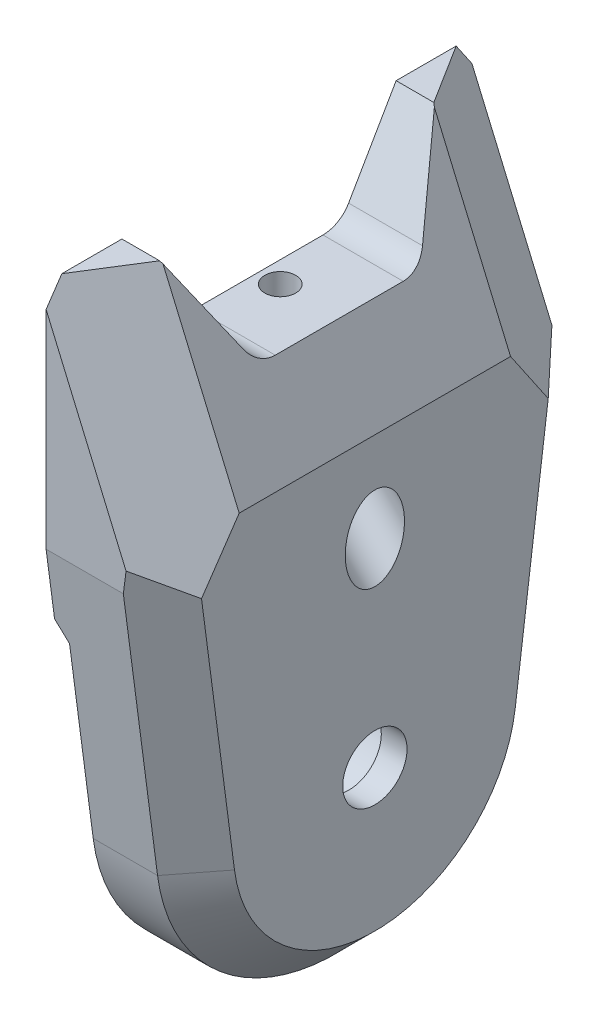
ISO-10303-21;
HEADER;
FILE_DESCRIPTION(('STEP AP214'),'2;1');
FILE_NAME('part.step','',(''),(''),'','','');
FILE_SCHEMA(('AUTOMOTIVE_DESIGN { 1 0 10303 214 1 1 1 1 }'));
ENDSEC;
DATA;
#1=APPLICATION_CONTEXT('core data for automotive mechanical design processes');
#2=APPLICATION_PROTOCOL_DEFINITION('international standard','automotive_design',2000,#1);
#3=PRODUCT_CONTEXT('',#1,'mechanical');
#4=PRODUCT('Part','Part','',(#3));
#5=PRODUCT_RELATED_PRODUCT_CATEGORY('part','',(#4));
#6=PRODUCT_DEFINITION_FORMATION('','',#4);
#7=PRODUCT_DEFINITION_CONTEXT('part definition',#1,'design');
#8=PRODUCT_DEFINITION('design','',#6,#7);
#9=PRODUCT_DEFINITION_SHAPE('','',#8);
#10=(LENGTH_UNIT() NAMED_UNIT(*) SI_UNIT(.MILLI.,.METRE.));
#11=(NAMED_UNIT(*) PLANE_ANGLE_UNIT() SI_UNIT($,.RADIAN.));
#12=(NAMED_UNIT(*) SI_UNIT($,.STERADIAN.) SOLID_ANGLE_UNIT());
#13=UNCERTAINTY_MEASURE_WITH_UNIT(LENGTH_MEASURE(1.E-05),#10,'distance_accuracy_value','');
#14=(GEOMETRIC_REPRESENTATION_CONTEXT(3) GLOBAL_UNCERTAINTY_ASSIGNED_CONTEXT((#13)) GLOBAL_UNIT_ASSIGNED_CONTEXT((#10,
#11,#12)) REPRESENTATION_CONTEXT('',''));
#15=CARTESIAN_POINT('',(0.,0.,0.));
#16=DIRECTION('',(0.,0.,1.));
#17=DIRECTION('',(1.,0.,0.));
#18=AXIS2_PLACEMENT_3D('',#15,#16,#17);
#19=CARTESIAN_POINT('',(-4.,0.,0.));
#20=DIRECTION('',(1.,0.,0.));
#21=DIRECTION('',(0.,0.,-1.));
#22=AXIS2_PLACEMENT_3D('',#19,#20,#21);
#23=CYLINDRICAL_SURFACE('',#22,2.25);
#24=CARTESIAN_POINT('',(-4.,0.,0.));
#25=DIRECTION('',(1.,0.,0.));
#26=DIRECTION('',(0.,0.,-1.));
#27=AXIS2_PLACEMENT_3D('',#24,#25,#26);
#28=CIRCLE('',#27,2.25);
#29=CARTESIAN_POINT('',(-4.,0.,-2.25));
#30=VERTEX_POINT('',#29);
#31=EDGE_CURVE('E216',#30,#30,#28,.T.);
#32=ORIENTED_EDGE('',*,*,#31,.F.);
#33=EDGE_LOOP('',(#32));
#34=FACE_BOUND('',#33,.T.);
#35=CARTESIAN_POINT('',(-1.,0.,0.));
#36=DIRECTION('',(1.,0.,0.));
#37=DIRECTION('',(0.,0.,-1.));
#38=AXIS2_PLACEMENT_3D('',#35,#36,#37);
#39=CIRCLE('',#38,2.25);
#40=CARTESIAN_POINT('',(-1.,0.,-2.25));
#41=VERTEX_POINT('',#40);
#42=EDGE_CURVE('E263',#41,#41,#39,.F.);
#43=ORIENTED_EDGE('',*,*,#42,.F.);
#44=EDGE_LOOP('',(#43));
#45=FACE_BOUND('',#44,.T.);
#46=ADVANCED_FACE('F55',(#34,#45),#23,.F.);
#47=CARTESIAN_POINT('',(-4.5,-0.90952668653246,6.9406599979026));
#48=DIRECTION('',(0.,0.129932383790351,-0.991522856843228));
#49=DIRECTION('',(0.,0.991522856843228,0.129932383790351));
#50=AXIS2_PLACEMENT_3D('',#47,#48,#49);
#51=PLANE('',#50);
#52=DIRECTION('',(0.,0.991522856843228,0.129932383790351));
#53=VECTOR('',#52,1.);
#54=CARTESIAN_POINT('',(-4.5,-0.90952668653246,6.9406599979026));
#55=LINE('',#54,#53);
#56=CARTESIAN_POINT('',(-4.5,6.7265897388865,7.94132155926509));
#57=VERTEX_POINT('',#56);
#58=CARTESIAN_POINT('',(-4.5,9.23475727213278,8.27));
#59=VERTEX_POINT('',#58);
#60=EDGE_CURVE('E257',#57,#59,#55,.T.);
#61=ORIENTED_EDGE('',*,*,#60,.F.);
#62=DIRECTION('',(-0.621690055381958,0.776623514190531,0.101771274166774));
#63=VECTOR('',#62,1.);
#64=CARTESIAN_POINT('',(-1.46667801829035,2.93732343695185,7.44476376432495));
#65=LINE('',#64,#63);
#66=CARTESIAN_POINT('',(-4.,6.10198306594125,7.85947106697738));
#67=VERTEX_POINT('',#66);
#68=EDGE_CURVE('E12',#57,#67,#65,.F.);
#69=ORIENTED_EDGE('',*,*,#68,.T.);
#70=DIRECTION('',(0.,0.991522856843228,0.129932383790351));
#71=VECTOR('',#70,1.);
#72=CARTESIAN_POINT('',(-4.,-0.90952668653246,6.9406599979026));
#73=LINE('',#72,#71);
#74=CARTESIAN_POINT('',(-4.,-0.909526686532459,6.9406599979026));
#75=VERTEX_POINT('',#74);
#76=EDGE_CURVE('E219',#75,#67,#73,.T.);
#77=ORIENTED_EDGE('',*,*,#76,.F.);
#78=DIRECTION('',(1.,0.,0.));
#79=VECTOR('',#78,1.);
#80=CARTESIAN_POINT('',(-4.,-0.909526686532459,6.9406599979026));
#81=LINE('',#80,#79);
#82=CARTESIAN_POINT('',(-1.50000000000002,-0.909526686532459,6.9406599979026));
#83=VERTEX_POINT('',#82);
#84=EDGE_CURVE('E204',#75,#83,#81,.T.);
#85=ORIENTED_EDGE('',*,*,#84,.T.);
#86=DIRECTION('',(0.,0.991522856843228,0.129932383790351));
#87=VECTOR('',#86,1.);
#88=CARTESIAN_POINT('',(-1.50000000000002,7.19063448818806,8.00213149425147));
#89=LINE('',#88,#87);
#90=CARTESIAN_POINT('',(-1.50000000000002,9.23475727213278,8.27));
#91=VERTEX_POINT('',#90);
#92=EDGE_CURVE('E333',#83,#91,#89,.T.);
#93=ORIENTED_EDGE('',*,*,#92,.T.);
#94=DIRECTION('',(1.,0.,0.));
#95=VECTOR('',#94,1.);
#96=CARTESIAN_POINT('',(-4.5,9.23475727213278,8.27));
#97=LINE('',#96,#95);
#98=EDGE_CURVE('E260',#59,#91,#97,.T.);
#99=ORIENTED_EDGE('',*,*,#98,.F.);
#100=EDGE_LOOP('',(#61,#69,#77,#85,#93,#99));
#101=FACE_BOUND('',#100,.T.);
#102=ADVANCED_FACE('F221',(#101),#51,.F.);
#103=CARTESIAN_POINT('',(-4.5,0.,8.27));
#104=DIRECTION('',(0.,0.,-1.));
#105=DIRECTION('',(-1.,0.,0.));
#106=AXIS2_PLACEMENT_3D('',#103,#104,#105);
#107=PLANE('',#106);
#108=ORIENTED_EDGE('',*,*,#98,.T.);
#109=DIRECTION('',(0.128849291751935,0.991664187119322,0.));
#110=VECTOR('',#109,1.);
#111=CARTESIAN_POINT('',(-2.79618819740001,-0.74110986420336,8.27));
#112=LINE('',#111,#110);
#113=CARTESIAN_POINT('',(-1.3939868585545,10.0506673505361,8.27));
#114=VERTEX_POINT('',#113);
#115=EDGE_CURVE('E335',#91,#114,#112,.T.);
#116=ORIENTED_EDGE('',*,*,#115,.T.);
#117=DIRECTION('',(-0.393919298579166,0.919145030018059,0.));
#118=VECTOR('',#117,1.);
#119=CARTESIAN_POINT('',(-4.59200589151571,17.512711760779,8.27));
#120=LINE('',#119,#118);
#121=CARTESIAN_POINT('',(-4.5,17.2980313472423,8.27));
#122=VERTEX_POINT('',#121);
#123=EDGE_CURVE('E327',#114,#122,#120,.T.);
#124=ORIENTED_EDGE('',*,*,#123,.T.);
#125=DIRECTION('',(0.,1.,0.));
#126=VECTOR('',#125,1.);
#127=CARTESIAN_POINT('',(-4.5,0.,8.27));
#128=LINE('',#127,#126);
#129=EDGE_CURVE('E254',#59,#122,#128,.T.);
#130=ORIENTED_EDGE('',*,*,#129,.F.);
#131=EDGE_LOOP('',(#108,#116,#124,#130));
#132=FACE_BOUND('',#131,.T.);
#133=ADVANCED_FACE('F397',(#132),#107,.F.);
#134=CARTESIAN_POINT('',(-4.5,18.195,0.));
#135=DIRECTION('',(0.,-1.,0.));
#136=DIRECTION('',(0.,0.,-1.));
#137=AXIS2_PLACEMENT_3D('',#134,#135,#136);
#138=PLANE('',#137);
#139=DIRECTION('',(0.,0.,-1.));
#140=VECTOR('',#139,1.);
#141=CARTESIAN_POINT('',(-4.5,18.195,0.));
#142=LINE('',#141,#140);
#143=CARTESIAN_POINT('',(-4.5,18.195,7.65800883727353));
#144=VERTEX_POINT('',#143);
#145=CARTESIAN_POINT('',(-4.5,18.195,5.32500000000004));
#146=VERTEX_POINT('',#145);
#147=EDGE_CURVE('E251',#144,#146,#142,.T.);
#148=ORIENTED_EDGE('',*,*,#147,.F.);
#149=DIRECTION('',(0.53190866628425,0.,-0.846801730472789));
#150=VECTOR('',#149,1.);
#151=CARTESIAN_POINT('',(-3.00366032600804,18.195,5.27582726056963));
#152=LINE('',#151,#150);
#153=CARTESIAN_POINT('',(-3.03454761084314,18.195,5.32500000000004));
#154=VERTEX_POINT('',#153);
#155=EDGE_CURVE('E329',#144,#154,#152,.T.);
#156=ORIENTED_EDGE('',*,*,#155,.T.);
#157=DIRECTION('',(-1.,0.,0.));
#158=VECTOR('',#157,1.);
#159=CARTESIAN_POINT('',(-4.5,18.195,5.32500000000004));
#160=LINE('',#159,#158);
#161=EDGE_CURVE('E277',#154,#146,#160,.T.);
#162=ORIENTED_EDGE('',*,*,#161,.T.);
#163=EDGE_LOOP('',(#148,#156,#162));
#164=FACE_BOUND('',#163,.T.);
#165=ADVANCED_FACE('F417',(#164),#138,.F.);
#166=CARTESIAN_POINT('',(-4.5,14.425,0.));
#167=DIRECTION('',(0.,-1.,0.));
#168=DIRECTION('',(0.,0.,-1.));
#169=AXIS2_PLACEMENT_3D('',#166,#167,#168);
#170=PLANE('',#169);
#171=CARTESIAN_POINT('',(-3.675,14.425,0.));
#172=DIRECTION('',(0.,-1.,0.));
#173=DIRECTION('',(0.,0.,-1.));
#174=AXIS2_PLACEMENT_3D('',#171,#172,#173);
#175=CIRCLE('',#174,0.6);
#176=CARTESIAN_POINT('',(-3.675,14.425,-0.6));
#177=VERTEX_POINT('',#176);
#178=EDGE_CURVE('E556',#177,#177,#175,.T.);
#179=ORIENTED_EDGE('',*,*,#178,.T.);
#180=EDGE_LOOP('',(#179));
#181=FACE_BOUND('',#180,.T.);
#182=DIRECTION('',(-1.,0.,0.));
#183=VECTOR('',#182,1.);
#184=CARTESIAN_POINT('',(-4.5,14.425,2.4844366755871));
#185=LINE('',#184,#183);
#186=CARTESIAN_POINT('',(-4.5,14.425,2.4844366755871));
#187=VERTEX_POINT('',#186);
#188=CARTESIAN_POINT('',(-1.38428571428573,14.425,2.4844366755871));
#189=VERTEX_POINT('',#188);
#190=EDGE_CURVE('E279',#187,#189,#185,.F.);
#191=ORIENTED_EDGE('',*,*,#190,.T.);
#192=DIRECTION('',(0.,0.,-1.));
#193=VECTOR('',#192,1.);
#194=CARTESIAN_POINT('',(-1.38428571428573,14.425,0.));
#195=LINE('',#194,#193);
#196=CARTESIAN_POINT('',(-1.38428571428573,14.425,-2.4844366755871));
#197=VERTEX_POINT('',#196);
#198=EDGE_CURVE('E297',#189,#197,#195,.T.);
#199=ORIENTED_EDGE('',*,*,#198,.T.);
#200=DIRECTION('',(1.,0.,0.));
#201=VECTOR('',#200,1.);
#202=CARTESIAN_POINT('',(-4.5,14.425,-2.4844366755871));
#203=LINE('',#202,#201);
#204=CARTESIAN_POINT('',(-4.5,14.425,-2.4844366755871));
#205=VERTEX_POINT('',#204);
#206=EDGE_CURVE('E282',#197,#205,#203,.F.);
#207=ORIENTED_EDGE('',*,*,#206,.T.);
#208=DIRECTION('',(0.,0.,-1.));
#209=VECTOR('',#208,1.);
#210=CARTESIAN_POINT('',(-4.5,14.425,0.));
#211=LINE('',#210,#209);
#212=EDGE_CURVE('E248',#187,#205,#211,.T.);
#213=ORIENTED_EDGE('',*,*,#212,.F.);
#214=EDGE_LOOP('',(#191,#199,#207,#213));
#215=FACE_BOUND('',#214,.T.);
#216=ADVANCED_FACE('F421',(#181,#215),#170,.F.);
#217=CARTESIAN_POINT('',(-4.5,18.195,0.));
#218=DIRECTION('',(0.,1.,0.));
#219=DIRECTION('',(0.,0.,1.));
#220=AXIS2_PLACEMENT_3D('',#217,#218,#219);
#221=PLANE('',#220);
#222=DIRECTION('',(1.,0.,0.));
#223=VECTOR('',#222,1.);
#224=CARTESIAN_POINT('',(-4.5,18.195,-5.32500000000004));
#225=LINE('',#224,#223);
#226=CARTESIAN_POINT('',(-4.5,18.195,-5.32500000000004));
#227=VERTEX_POINT('',#226);
#228=CARTESIAN_POINT('',(-3.03454761084314,18.195,-5.32500000000004));
#229=VERTEX_POINT('',#228);
#230=EDGE_CURVE('E268',#227,#229,#225,.T.);
#231=ORIENTED_EDGE('',*,*,#230,.T.);
#232=DIRECTION('',(-0.53190866628425,0.,-0.846801730472789));
#233=VECTOR('',#232,1.);
#234=CARTESIAN_POINT('',(-1.05067063024056,18.195,-2.16665615883834));
#235=LINE('',#234,#233);
#236=CARTESIAN_POINT('',(-4.5,18.195,-7.65800883727353));
#237=VERTEX_POINT('',#236);
#238=EDGE_CURVE('E321',#229,#237,#235,.T.);
#239=ORIENTED_EDGE('',*,*,#238,.T.);
#240=DIRECTION('',(0.,0.,1.));
#241=VECTOR('',#240,1.);
#242=CARTESIAN_POINT('',(-4.5,18.195,0.));
#243=LINE('',#242,#241);
#244=EDGE_CURVE('E246',#237,#227,#243,.T.);
#245=ORIENTED_EDGE('',*,*,#244,.T.);
#246=EDGE_LOOP('',(#231,#239,#245));
#247=FACE_BOUND('',#246,.T.);
#248=ADVANCED_FACE('F425',(#247),#221,.T.);
#249=CARTESIAN_POINT('',(-4.5,0.,-8.27));
#250=DIRECTION('',(0.,0.,1.));
#251=DIRECTION('',(1.,0.,0.));
#252=AXIS2_PLACEMENT_3D('',#249,#250,#251);
#253=PLANE('',#252);
#254=DIRECTION('',(0.393919298579166,-0.919145030018059,0.));
#255=VECTOR('',#254,1.);
#256=CARTESIAN_POINT('',(-1.5920058915157,10.5127117607789,-8.27));
#257=LINE('',#256,#255);
#258=CARTESIAN_POINT('',(-4.5,17.2980313472423,-8.27));
#259=VERTEX_POINT('',#258);
#260=CARTESIAN_POINT('',(-1.3939868585545,10.0506673505361,-8.27));
#261=VERTEX_POINT('',#260);
#262=EDGE_CURVE('E307',#259,#261,#257,.T.);
#263=ORIENTED_EDGE('',*,*,#262,.T.);
#264=DIRECTION('',(-0.128849291751935,-0.991664187119322,0.));
#265=VECTOR('',#264,1.);
#266=CARTESIAN_POINT('',(-2.79618819740001,-0.74110986420336,-8.27));
#267=LINE('',#266,#265);
#268=CARTESIAN_POINT('',(-1.50000000000002,9.23475727213278,-8.27));
#269=VERTEX_POINT('',#268);
#270=EDGE_CURVE('E349',#261,#269,#267,.T.);
#271=ORIENTED_EDGE('',*,*,#270,.T.);
#272=DIRECTION('',(1.,0.,0.));
#273=VECTOR('',#272,1.);
#274=CARTESIAN_POINT('',(-4.5,9.23475727213278,-8.27));
#275=LINE('',#274,#273);
#276=CARTESIAN_POINT('',(-4.5,9.23475727213278,-8.27));
#277=VERTEX_POINT('',#276);
#278=EDGE_CURVE('E259',#277,#269,#275,.T.);
#279=ORIENTED_EDGE('',*,*,#278,.F.);
#280=DIRECTION('',(0.,-1.,0.));
#281=VECTOR('',#280,1.);
#282=CARTESIAN_POINT('',(-4.5,0.,-8.27));
#283=LINE('',#282,#281);
#284=EDGE_CURVE('E244',#259,#277,#283,.T.);
#285=ORIENTED_EDGE('',*,*,#284,.F.);
#286=EDGE_LOOP('',(#263,#271,#279,#285));
#287=FACE_BOUND('',#286,.T.);
#288=ADVANCED_FACE('F429',(#287),#253,.F.);
#289=CARTESIAN_POINT('',(-4.5,-0.909526686532459,-6.9406599979026));
#290=DIRECTION('',(0.,0.129932383790351,0.991522856843228));
#291=DIRECTION('',(0.,-0.991522856843228,0.129932383790351));
#292=AXIS2_PLACEMENT_3D('',#289,#290,#291);
#293=PLANE('',#292);
#294=DIRECTION('',(0.,-0.991522856843228,0.129932383790351));
#295=VECTOR('',#294,1.);
#296=CARTESIAN_POINT('',(-4.,-0.909526686532459,-6.9406599979026));
#297=LINE('',#296,#295);
#298=CARTESIAN_POINT('',(-4.,6.10198306594125,-7.85947106697738));
#299=VERTEX_POINT('',#298);
#300=CARTESIAN_POINT('',(-4.,-0.909526686532462,-6.9406599979026));
#301=VERTEX_POINT('',#300);
#302=EDGE_CURVE('E231',#299,#301,#297,.T.);
#303=ORIENTED_EDGE('',*,*,#302,.F.);
#304=DIRECTION('',(-0.621690055381959,0.77662351419053,-0.101771274166774));
#305=VECTOR('',#304,1.);
#306=CARTESIAN_POINT('',(-1.08017949332953,2.45450432140382,-7.38149357525192));
#307=LINE('',#306,#305);
#308=CARTESIAN_POINT('',(-4.5,6.72658973888649,-7.94132155926509));
#309=VERTEX_POINT('',#308);
#310=EDGE_CURVE('E352',#299,#309,#307,.T.);
#311=ORIENTED_EDGE('',*,*,#310,.T.);
#312=DIRECTION('',(0.,-0.991522856843228,0.129932383790351));
#313=VECTOR('',#312,1.);
#314=CARTESIAN_POINT('',(-4.5,-0.909526686532459,-6.9406599979026));
#315=LINE('',#314,#313);
#316=EDGE_CURVE('E241',#277,#309,#315,.T.);
#317=ORIENTED_EDGE('',*,*,#316,.F.);
#318=ORIENTED_EDGE('',*,*,#278,.T.);
#319=DIRECTION('',(0.,-0.991522856843228,0.129932383790351));
#320=VECTOR('',#319,1.);
#321=CARTESIAN_POINT('',(-1.50000000000002,-0.909526686532462,-6.9406599979026));
#322=LINE('',#321,#320);
#323=CARTESIAN_POINT('',(-1.50000000000002,-0.909526686532462,-6.9406599979026));
#324=VERTEX_POINT('',#323);
#325=EDGE_CURVE('E345',#269,#324,#322,.T.);
#326=ORIENTED_EDGE('',*,*,#325,.T.);
#327=DIRECTION('',(1.,0.,0.));
#328=VECTOR('',#327,1.);
#329=CARTESIAN_POINT('',(-4.,-0.909526686532462,-6.9406599979026));
#330=LINE('',#329,#328);
#331=EDGE_CURVE('E215',#301,#324,#330,.T.);
#332=ORIENTED_EDGE('',*,*,#331,.F.);
#333=EDGE_LOOP('',(#303,#311,#317,#318,#326,#332));
#334=FACE_BOUND('',#333,.T.);
#335=ADVANCED_FACE('F410',(#334),#293,.F.);
#336=CARTESIAN_POINT('',(-4.5,0.,0.));
#337=DIRECTION('',(1.,0.,0.));
#338=DIRECTION('',(0.,0.,-1.));
#339=AXIS2_PLACEMENT_3D('',#336,#337,#338);
#340=PLANE('',#339);
#341=CARTESIAN_POINT('',(-4.5,11.925,-6.25));
#342=DIRECTION('',(1.,0.,0.));
#343=DIRECTION('',(0.,0.,-1.));
#344=AXIS2_PLACEMENT_3D('',#341,#342,#343);
#345=CIRCLE('',#344,1.05);
#346=CARTESIAN_POINT('',(-4.5,11.925,-7.3));
#347=VERTEX_POINT('',#346);
#348=EDGE_CURVE('E357',#347,#347,#345,.T.);
#349=ORIENTED_EDGE('',*,*,#348,.T.);
#350=EDGE_LOOP('',(#349));
#351=FACE_BOUND('',#350,.T.);
#352=CARTESIAN_POINT('',(-4.5,11.925,6.25));
#353=DIRECTION('',(1.,0.,0.));
#354=DIRECTION('',(0.,0.,-1.));
#355=AXIS2_PLACEMENT_3D('',#352,#353,#354);
#356=CIRCLE('',#355,1.05);
#357=CARTESIAN_POINT('',(-4.5,11.925,5.2));
#358=VERTEX_POINT('',#357);
#359=EDGE_CURVE('E565',#358,#358,#356,.T.);
#360=ORIENTED_EDGE('',*,*,#359,.T.);
#361=EDGE_LOOP('',(#360));
#362=FACE_BOUND('',#361,.T.);
#363=ORIENTED_EDGE('',*,*,#316,.T.);
#364=DIRECTION('',(0.,-0.5,0.866025403784439));
#365=VECTOR('',#364,1.);
#366=CARTESIAN_POINT('',(-4.5,5.09102638582408,-5.10844273276328));
#367=LINE('',#366,#365);
#368=CARTESIAN_POINT('',(-4.5,5.29135270339672,-5.45541809289226));
#369=VERTEX_POINT('',#368);
#370=EDGE_CURVE('E71',#309,#369,#367,.T.);
#371=ORIENTED_EDGE('',*,*,#370,.T.);
#372=CARTESIAN_POINT('',(-4.5,0.,0.));
#373=DIRECTION('',(1.,0.,0.));
#374=DIRECTION('',(0.,0.,-1.));
#375=AXIS2_PLACEMENT_3D('',#372,#373,#374);
#376=CIRCLE('',#375,7.6);
#377=CARTESIAN_POINT('',(-4.5,5.29135270339672,5.45541809289226));
#378=VERTEX_POINT('',#377);
#379=EDGE_CURVE('E82',#369,#378,#376,.T.);
#380=ORIENTED_EDGE('',*,*,#379,.T.);
#381=DIRECTION('',(0.,0.499999999999999,0.866025403784439));
#382=VECTOR('',#381,1.);
#383=CARTESIAN_POINT('',(-4.5,1.60624919919257,-0.92736840753945));
#384=LINE('',#383,#382);
#385=EDGE_CURVE('E367',#378,#57,#384,.T.);
#386=ORIENTED_EDGE('',*,*,#385,.T.);
#387=ORIENTED_EDGE('',*,*,#60,.T.);
#388=ORIENTED_EDGE('',*,*,#129,.T.);
#389=DIRECTION('',(0.,0.826046573249033,-0.563601861976635));
#390=VECTOR('',#389,1.);
#391=CARTESIAN_POINT('',(-4.5,7.32622504118498,15.0736461664129));
#392=LINE('',#391,#390);
#393=EDGE_CURVE('E323',#122,#144,#392,.T.);
#394=ORIENTED_EDGE('',*,*,#393,.T.);
#395=ORIENTED_EDGE('',*,*,#147,.T.);
#396=DIRECTION('',(0.,0.866025403784441,0.499999999999996));
#397=VECTOR('',#396,1.);
#398=CARTESIAN_POINT('',(-4.5,12.9988475772933,2.325));
#399=LINE('',#398,#397);
#400=CARTESIAN_POINT('',(-4.5,15.,3.4803658899392));
#401=VERTEX_POINT('',#400);
#402=EDGE_CURVE('E271',#146,#401,#399,.F.);
#403=ORIENTED_EDGE('',*,*,#402,.T.);
#404=CARTESIAN_POINT('',(-4.5,15.575,2.4844366755871));
#405=DIRECTION('',(1.,0.,0.));
#406=DIRECTION('',(0.,0.,-1.));
#407=AXIS2_PLACEMENT_3D('',#404,#405,#406);
#408=CIRCLE('',#407,1.15);
#409=EDGE_CURVE('E291',#401,#187,#408,.T.);
#410=ORIENTED_EDGE('',*,*,#409,.T.);
#411=ORIENTED_EDGE('',*,*,#212,.T.);
#412=CARTESIAN_POINT('',(-4.5,15.575,-2.4844366755871));
#413=DIRECTION('',(1.,0.,0.));
#414=DIRECTION('',(0.,0.,-1.));
#415=AXIS2_PLACEMENT_3D('',#412,#413,#414);
#416=CIRCLE('',#415,1.15);
#417=CARTESIAN_POINT('',(-4.5,15.,-3.4803658899392));
#418=VERTEX_POINT('',#417);
#419=EDGE_CURVE('E289',#205,#418,#416,.T.);
#420=ORIENTED_EDGE('',*,*,#419,.T.);
#421=DIRECTION('',(0.,-0.866025403784441,0.499999999999996));
#422=VECTOR('',#421,1.);
#423=CARTESIAN_POINT('',(-4.5,18.195,-5.32500000000004));
#424=LINE('',#423,#422);
#425=EDGE_CURVE('E274',#418,#227,#424,.F.);
#426=ORIENTED_EDGE('',*,*,#425,.T.);
#427=ORIENTED_EDGE('',*,*,#244,.F.);
#428=DIRECTION('',(0.,-0.826046573249033,-0.563601861976635));
#429=VECTOR('',#428,1.);
#430=CARTESIAN_POINT('',(-4.5,7.32622504118497,-15.0736461664129));
#431=LINE('',#430,#429);
#432=EDGE_CURVE('E325',#237,#259,#431,.T.);
#433=ORIENTED_EDGE('',*,*,#432,.T.);
#434=ORIENTED_EDGE('',*,*,#284,.T.);
#435=EDGE_LOOP('',(#363,#371,#380,#386,#387,#388,#394,#395,#403,#410,#411,#420,#426,#427,#433,#434));
#436=FACE_BOUND('',#435,.T.);
#437=ADVANCED_FACE('F407',(#351,#362,#436),#340,.F.);
#438=CARTESIAN_POINT('',(0.,0.,0.));
#439=DIRECTION('',(1.,0.,0.));
#440=DIRECTION('',(0.,0.,-1.));
#441=AXIS2_PLACEMENT_3D('',#438,#439,#440);
#442=PLANE('',#441);
#443=CARTESIAN_POINT('',(0.,7.71446609406728,0.));
#444=DIRECTION('',(1.,0.,0.));
#445=DIRECTION('',(0.,-1.,0.));
#446=AXIS2_PLACEMENT_3D('',#443,#444,#445);
#447=ELLIPSE('',#446,1.62634559672906,1.15);
#448=CARTESIAN_POINT('',(0.,6.08812049733822,0.));
#449=VERTEX_POINT('',#448);
#450=EDGE_CURVE('E361',#449,#449,#447,.T.);
#451=ORIENTED_EDGE('',*,*,#450,.F.);
#452=EDGE_LOOP('',(#451));
#453=FACE_BOUND('',#452,.T.);
#454=DIRECTION('',(0.,-0.826046573249033,0.563601861976635));
#455=VECTOR('',#454,1.);
#456=CARTESIAN_POINT('',(0.,6.00956733176815,8.80795972480697));
#457=LINE('',#456,#455);
#458=CARTESIAN_POINT('',(0.,11.1949999999999,5.26999999999998));
#459=VERTEX_POINT('',#458);
#460=CARTESIAN_POINT('',(0.,9.05066872725695,6.73305200838635));
#461=VERTEX_POINT('',#460);
#462=EDGE_CURVE('E310',#459,#461,#457,.T.);
#463=ORIENTED_EDGE('',*,*,#462,.T.);
#464=DIRECTION('',(0.,-0.991522856843228,-0.129932383790351));
#465=VECTOR('',#464,1.);
#466=CARTESIAN_POINT('',(0.,-0.714628110846931,5.45337571263775));
#467=LINE('',#466,#465);
#468=CARTESIAN_POINT('',(0.,-0.714628110846931,5.45337571263775));
#469=VERTEX_POINT('',#468);
#470=EDGE_CURVE('E343',#461,#469,#467,.T.);
#471=ORIENTED_EDGE('',*,*,#470,.T.);
#472=CARTESIAN_POINT('',(0.,0.,0.));
#473=DIRECTION('',(1.,0.,0.));
#474=DIRECTION('',(0.,0.,-1.));
#475=AXIS2_PLACEMENT_3D('',#472,#473,#474);
#476=CIRCLE('',#475,5.49999999999999);
#477=CARTESIAN_POINT('',(0.,-0.714628110846934,-5.45337571263775));
#478=VERTEX_POINT('',#477);
#479=EDGE_CURVE('E339',#469,#478,#476,.T.);
#480=ORIENTED_EDGE('',*,*,#479,.T.);
#481=DIRECTION('',(0.,0.991522856843228,-0.129932383790351));
#482=VECTOR('',#481,1.);
#483=CARTESIAN_POINT('',(0.,7.38553306387358,-6.51484720898662));
#484=LINE('',#483,#482);
#485=CARTESIAN_POINT('',(0.,9.05066872725695,-6.73305200838635));
#486=VERTEX_POINT('',#485);
#487=EDGE_CURVE('E341',#478,#486,#484,.T.);
#488=ORIENTED_EDGE('',*,*,#487,.T.);
#489=DIRECTION('',(0.,0.826046573249033,0.563601861976635));
#490=VECTOR('',#489,1.);
#491=CARTESIAN_POINT('',(0.,6.00956733176815,-8.80795972480697));
#492=LINE('',#491,#490);
#493=CARTESIAN_POINT('',(0.,11.1949999999999,-5.26999999999998));
#494=VERTEX_POINT('',#493);
#495=EDGE_CURVE('E313',#486,#494,#492,.T.);
#496=ORIENTED_EDGE('',*,*,#495,.T.);
#497=DIRECTION('',(0.,0.,1.));
#498=VECTOR('',#497,1.);
#499=CARTESIAN_POINT('',(0.,11.1949999999999,8.27));
#500=LINE('',#499,#498);
#501=EDGE_CURVE('E304',#494,#459,#500,.T.);
#502=ORIENTED_EDGE('',*,*,#501,.T.);
#503=EDGE_LOOP('',(#463,#471,#480,#488,#496,#502));
#504=FACE_BOUND('',#503,.T.);
#505=CARTESIAN_POINT('',(0.,0.,0.));
#506=DIRECTION('',(1.,0.,0.));
#507=DIRECTION('',(0.,0.,-1.));
#508=AXIS2_PLACEMENT_3D('',#505,#506,#507);
#509=CIRCLE('',#508,1.25);
#510=CARTESIAN_POINT('',(0.,0.,-1.25));
#511=VERTEX_POINT('',#510);
#512=EDGE_CURVE('E360',#511,#511,#509,.T.);
#513=ORIENTED_EDGE('',*,*,#512,.F.);
#514=EDGE_LOOP('',(#513));
#515=FACE_BOUND('',#514,.T.);
#516=ADVANCED_FACE('F406',(#453,#504,#515),#442,.T.);
#517=CARTESIAN_POINT('',(-4.,0.,0.));
#518=DIRECTION('',(1.,0.,0.));
#519=DIRECTION('',(0.,0.,-1.));
#520=AXIS2_PLACEMENT_3D('',#517,#518,#519);
#521=CYLINDRICAL_SURFACE('',#520,7.);
#522=ORIENTED_EDGE('',*,*,#331,.T.);
#523=CARTESIAN_POINT('',(-1.50000000000002,0.,0.));
#524=DIRECTION('',(1.,0.,0.));
#525=DIRECTION('',(0.,0.,-1.));
#526=AXIS2_PLACEMENT_3D('',#523,#524,#525);
#527=CIRCLE('',#526,7.);
#528=EDGE_CURVE('E211',#324,#83,#527,.F.);
#529=ORIENTED_EDGE('',*,*,#528,.T.);
#530=ORIENTED_EDGE('',*,*,#84,.F.);
#531=CARTESIAN_POINT('',(-4.,0.,0.));
#532=DIRECTION('',(1.,0.,0.));
#533=DIRECTION('',(0.,0.,-1.));
#534=AXIS2_PLACEMENT_3D('',#531,#532,#533);
#535=CIRCLE('',#534,7.);
#536=EDGE_CURVE('E209',#75,#301,#535,.T.);
#537=ORIENTED_EDGE('',*,*,#536,.T.);
#538=EDGE_LOOP('',(#522,#529,#530,#537));
#539=FACE_BOUND('',#538,.T.);
#540=ADVANCED_FACE('F207',(#539),#521,.T.);
#541=CARTESIAN_POINT('',(-4.,0.,0.));
#542=DIRECTION('',(1.,0.,0.));
#543=DIRECTION('',(0.,0.,-1.));
#544=AXIS2_PLACEMENT_3D('',#541,#542,#543);
#545=PLANE('',#544);
#546=CARTESIAN_POINT('',(-4.,0.,0.));
#547=DIRECTION('',(1.,0.,0.));
#548=DIRECTION('',(0.,0.,-1.));
#549=AXIS2_PLACEMENT_3D('',#546,#547,#548);
#550=CIRCLE('',#549,7.1);
#551=CARTESIAN_POINT('',(-4.,4.65801368393186,5.35844273276328));
#552=VERTEX_POINT('',#551);
#553=CARTESIAN_POINT('',(-4.,4.65801368393186,-5.35844273276328));
#554=VERTEX_POINT('',#553);
#555=EDGE_CURVE('E539',#552,#554,#550,.F.);
#556=ORIENTED_EDGE('',*,*,#555,.T.);
#557=DIRECTION('',(0.,0.5,-0.866025403784439));
#558=VECTOR('',#557,1.);
#559=CARTESIAN_POINT('',(-4.,1.17323649730035,0.677368407539448));
#560=LINE('',#559,#558);
#561=EDGE_CURVE('E234',#554,#299,#560,.T.);
#562=ORIENTED_EDGE('',*,*,#561,.T.);
#563=ORIENTED_EDGE('',*,*,#302,.T.);
#564=ORIENTED_EDGE('',*,*,#536,.F.);
#565=ORIENTED_EDGE('',*,*,#76,.T.);
#566=DIRECTION('',(0.,0.499999999999999,0.866025403784439));
#567=VECTOR('',#566,1.);
#568=CARTESIAN_POINT('',(-4.,1.17323649730035,-0.67736840753945));
#569=LINE('',#568,#567);
#570=EDGE_CURVE('E225',#552,#67,#569,.T.);
#571=ORIENTED_EDGE('',*,*,#570,.F.);
#572=EDGE_LOOP('',(#556,#562,#563,#564,#565,#571));
#573=FACE_BOUND('',#572,.T.);
#574=ORIENTED_EDGE('',*,*,#31,.T.);
#575=EDGE_LOOP('',(#574));
#576=FACE_BOUND('',#575,.T.);
#577=ADVANCED_FACE('F227',(#573,#576),#545,.F.);
#578=CARTESIAN_POINT('',(-1.,0.,0.));
#579=DIRECTION('',(1.,0.,0.));
#580=DIRECTION('',(0.,0.,-1.));
#581=AXIS2_PLACEMENT_3D('',#578,#579,#580);
#582=CYLINDRICAL_SURFACE('',#581,1.25);
#583=CARTESIAN_POINT('',(-1.,0.,0.));
#584=DIRECTION('',(1.,0.,0.));
#585=DIRECTION('',(0.,0.,-1.));
#586=AXIS2_PLACEMENT_3D('',#583,#584,#585);
#587=CIRCLE('',#586,1.25);
#588=CARTESIAN_POINT('',(-1.,0.,-1.25));
#589=VERTEX_POINT('',#588);
#590=EDGE_CURVE('E543',#589,#589,#587,.T.);
#591=ORIENTED_EDGE('',*,*,#590,.F.);
#592=EDGE_LOOP('',(#591));
#593=FACE_BOUND('',#592,.T.);
#594=ORIENTED_EDGE('',*,*,#512,.T.);
#595=EDGE_LOOP('',(#594));
#596=FACE_BOUND('',#595,.T.);
#597=ADVANCED_FACE('F626',(#593,#596),#582,.F.);
#598=CARTESIAN_POINT('',(-1.,0.,0.));
#599=DIRECTION('',(1.,0.,0.));
#600=DIRECTION('',(0.,0.,-1.));
#601=AXIS2_PLACEMENT_3D('',#598,#599,#600);
#602=PLANE('',#601);
#603=ORIENTED_EDGE('',*,*,#590,.T.);
#604=EDGE_LOOP('',(#603));
#605=FACE_BOUND('',#604,.T.);
#606=ORIENTED_EDGE('',*,*,#42,.T.);
#607=EDGE_LOOP('',(#606));
#608=FACE_BOUND('',#607,.T.);
#609=ADVANCED_FACE('F445',(#605,#608),#602,.F.);
#610=CARTESIAN_POINT('',(-4.5,18.195,-5.32500000000004));
#611=DIRECTION('',(0.,-0.499999999999996,-0.866025403784441));
#612=DIRECTION('',(1.,0.,0.));
#613=AXIS2_PLACEMENT_3D('',#610,#611,#612);
#614=PLANE('',#613);
#615=DIRECTION('',(0.347960102862176,-0.811906906678414,0.468754671127694));
#616=VECTOR('',#615,1.);
#617=CARTESIAN_POINT('',(-3.18161434977579,18.6187668161435,-5.56966188537411));
#618=LINE('',#617,#616);
#619=CARTESIAN_POINT('',(-1.6307142857143,15.,-3.4803658899392));
#620=VERTEX_POINT('',#619);
#621=CARTESIAN_POINT('',(-2.95917308810728,18.0997372055836,-5.26999999999998));
#622=VERTEX_POINT('',#621);
#623=EDGE_CURVE('E301',#620,#622,#618,.F.);
#624=ORIENTED_EDGE('',*,*,#623,.T.);
#625=DIRECTION('',(0.565252631050183,-0.714399816152088,0.412458926164423));
#626=VECTOR('',#625,1.);
#627=CARTESIAN_POINT('',(-3.50277509051745,18.7867736725528,-5.66666068914771));
#628=LINE('',#627,#626);
#629=EDGE_CURVE('E319',#622,#229,#628,.F.);
#630=ORIENTED_EDGE('',*,*,#629,.T.);
#631=ORIENTED_EDGE('',*,*,#230,.F.);
#632=ORIENTED_EDGE('',*,*,#425,.F.);
#633=DIRECTION('',(-1.,0.,0.));
#634=VECTOR('',#633,1.);
#635=CARTESIAN_POINT('',(-4.5,15.,-3.4803658899392));
#636=LINE('',#635,#634);
#637=EDGE_CURVE('E284',#418,#620,#636,.F.);
#638=ORIENTED_EDGE('',*,*,#637,.T.);
#639=EDGE_LOOP('',(#624,#630,#631,#632,#638));
#640=FACE_BOUND('',#639,.T.);
#641=ADVANCED_FACE('F438',(#640),#614,.F.);
#642=CARTESIAN_POINT('',(-4.5,12.9988475772933,2.325));
#643=DIRECTION('',(0.,-0.499999999999996,0.866025403784441));
#644=DIRECTION('',(1.,0.,0.));
#645=AXIS2_PLACEMENT_3D('',#642,#643,#644);
#646=PLANE('',#645);
#647=ORIENTED_EDGE('',*,*,#161,.F.);
#648=DIRECTION('',(-0.565252631050183,0.714399816152088,0.412458926164423));
#649=VECTOR('',#648,1.);
#650=CARTESIAN_POINT('',(-0.705053171942494,15.2508467002869,3.62519229987515));
#651=LINE('',#650,#649);
#652=CARTESIAN_POINT('',(-2.95917308810727,18.0997372055836,5.26999999999998));
#653=VERTEX_POINT('',#652);
#654=EDGE_CURVE('E331',#154,#653,#651,.F.);
#655=ORIENTED_EDGE('',*,*,#654,.T.);
#656=DIRECTION('',(-0.347960102862175,0.811906906678415,0.468754671127694));
#657=VECTOR('',#656,1.);
#658=CARTESIAN_POINT('',(-1.22431926678312,14.0517449558272,2.93289058492565));
#659=LINE('',#658,#657);
#660=CARTESIAN_POINT('',(-1.6307142857143,15.,3.4803658899392));
#661=VERTEX_POINT('',#660);
#662=EDGE_CURVE('E293',#653,#661,#659,.F.);
#663=ORIENTED_EDGE('',*,*,#662,.T.);
#664=DIRECTION('',(1.,0.,0.));
#665=VECTOR('',#664,1.);
#666=CARTESIAN_POINT('',(-4.5,15.,3.4803658899392));
#667=LINE('',#666,#665);
#668=EDGE_CURVE('E287',#661,#401,#667,.F.);
#669=ORIENTED_EDGE('',*,*,#668,.T.);
#670=ORIENTED_EDGE('',*,*,#402,.F.);
#671=EDGE_LOOP('',(#647,#655,#663,#669,#670));
#672=FACE_BOUND('',#671,.T.);
#673=ADVANCED_FACE('F444',(#672),#646,.F.);
#674=CARTESIAN_POINT('',(-4.5,15.575,-2.4844366755871));
#675=DIRECTION('',(1.,0.,0.));
#676=DIRECTION('',(0.,0.,-1.));
#677=AXIS2_PLACEMENT_3D('',#674,#675,#676);
#678=CYLINDRICAL_SURFACE('',#677,1.15);
#679=ORIENTED_EDGE('',*,*,#206,.F.);
#680=CARTESIAN_POINT('',(-1.87714285714287,15.575,-2.4844366755871));
#681=DIRECTION('',(0.919145030018059,0.393919298579166,0.));
#682=DIRECTION('',(0.393919298579166,-0.919145030018059,0.));
#683=AXIS2_PLACEMENT_3D('',#680,#681,#682);
#684=ELLIPSE('',#683,1.25116272453478,1.15);
#685=EDGE_CURVE('E299',#197,#620,#684,.T.);
#686=ORIENTED_EDGE('',*,*,#685,.T.);
#687=ORIENTED_EDGE('',*,*,#637,.F.);
#688=ORIENTED_EDGE('',*,*,#419,.F.);
#689=EDGE_LOOP('',(#679,#686,#687,#688));
#690=FACE_BOUND('',#689,.T.);
#691=ADVANCED_FACE('F452',(#690),#678,.F.);
#692=CARTESIAN_POINT('',(-4.5,15.575,2.4844366755871));
#693=DIRECTION('',(-1.,0.,0.));
#694=DIRECTION('',(0.,0.,1.));
#695=AXIS2_PLACEMENT_3D('',#692,#693,#694);
#696=CYLINDRICAL_SURFACE('',#695,1.15);
#697=ORIENTED_EDGE('',*,*,#668,.F.);
#698=CARTESIAN_POINT('',(-1.87714285714287,15.575,2.4844366755871));
#699=DIRECTION('',(0.919145030018059,0.393919298579166,0.));
#700=DIRECTION('',(-0.393919298579166,0.919145030018059,0.));
#701=AXIS2_PLACEMENT_3D('',#698,#699,#700);
#702=ELLIPSE('',#701,1.25116272453478,1.15);
#703=EDGE_CURVE('E295',#661,#189,#702,.T.);
#704=ORIENTED_EDGE('',*,*,#703,.T.);
#705=ORIENTED_EDGE('',*,*,#190,.F.);
#706=ORIENTED_EDGE('',*,*,#409,.F.);
#707=EDGE_LOOP('',(#697,#704,#705,#706));
#708=FACE_BOUND('',#707,.T.);
#709=ADVANCED_FACE('F456',(#708),#696,.F.);
#710=CARTESIAN_POINT('',(-3.00000000000001,18.195,0.));
#711=DIRECTION('',(0.919145030018059,0.393919298579166,0.));
#712=DIRECTION('',(0.,0.,1.));
#713=AXIS2_PLACEMENT_3D('',#710,#711,#712);
#714=PLANE('',#713);
#715=ORIENTED_EDGE('',*,*,#501,.F.);
#716=DIRECTION('',(-0.393919298579166,0.919145030018059,0.));
#717=VECTOR('',#716,1.);
#718=CARTESIAN_POINT('',(-3.00000000000001,18.195,-5.26999999999998));
#719=LINE('',#718,#717);
#720=EDGE_CURVE('E317',#494,#622,#719,.T.);
#721=ORIENTED_EDGE('',*,*,#720,.T.);
#722=ORIENTED_EDGE('',*,*,#623,.F.);
#723=ORIENTED_EDGE('',*,*,#685,.F.);
#724=ORIENTED_EDGE('',*,*,#198,.F.);
#725=ORIENTED_EDGE('',*,*,#703,.F.);
#726=ORIENTED_EDGE('',*,*,#662,.F.);
#727=DIRECTION('',(0.393919298579166,-0.919145030018059,0.));
#728=VECTOR('',#727,1.);
#729=CARTESIAN_POINT('',(0.,11.1949999999999,5.26999999999998));
#730=LINE('',#729,#728);
#731=EDGE_CURVE('E315',#653,#459,#730,.T.);
#732=ORIENTED_EDGE('',*,*,#731,.T.);
#733=EDGE_LOOP('',(#715,#721,#722,#723,#724,#725,#726,#732));
#734=FACE_BOUND('',#733,.T.);
#735=ADVANCED_FACE('F460',(#734),#714,.T.);
#736=CARTESIAN_POINT('',(1.76308031538082,2.68417727802034,-8.27));
#737=DIRECTION('',(0.79600294575785,0.341144119610505,-0.499999999999998));
#738=DIRECTION('',(-0.393919298579166,0.919145030018059,0.));
#739=AXIS2_PLACEMENT_3D('',#736,#737,#738);
#740=PLANE('',#739);
#741=ORIENTED_EDGE('',*,*,#495,.F.);
#742=DIRECTION('',(-0.605200639463258,0.434150295289369,-0.667267343044313));
#743=VECTOR('',#742,1.);
#744=CARTESIAN_POINT('',(1.69787603513004,7.83267037439632,-4.86104930894338));
#745=LINE('',#744,#743);
#746=EDGE_CURVE('E347',#486,#261,#745,.T.);
#747=ORIENTED_EDGE('',*,*,#746,.T.);
#748=ORIENTED_EDGE('',*,*,#262,.F.);
#749=ORIENTED_EDGE('',*,*,#432,.F.);
#750=ORIENTED_EDGE('',*,*,#238,.F.);
#751=ORIENTED_EDGE('',*,*,#629,.F.);
#752=ORIENTED_EDGE('',*,*,#720,.F.);
#753=EDGE_LOOP('',(#741,#747,#748,#749,#750,#751,#752));
#754=FACE_BOUND('',#753,.T.);
#755=ADVANCED_FACE('F467',(#754),#740,.T.);
#756=CARTESIAN_POINT('',(1.76308031538082,2.68417727802034,8.27));
#757=DIRECTION('',(0.796002945757851,0.341144119610505,0.499999999999998));
#758=DIRECTION('',(0.393919298579166,-0.919145030018059,0.));
#759=AXIS2_PLACEMENT_3D('',#756,#757,#758);
#760=PLANE('',#759);
#761=ORIENTED_EDGE('',*,*,#123,.F.);
#762=DIRECTION('',(0.605200639463258,-0.43415029528937,-0.667267343044313));
#763=VECTOR('',#762,1.);
#764=CARTESIAN_POINT('',(1.69787603513004,7.83267037439631,4.86104930894338));
#765=LINE('',#764,#763);
#766=EDGE_CURVE('E337',#114,#461,#765,.T.);
#767=ORIENTED_EDGE('',*,*,#766,.T.);
#768=ORIENTED_EDGE('',*,*,#462,.F.);
#769=ORIENTED_EDGE('',*,*,#731,.F.);
#770=ORIENTED_EDGE('',*,*,#654,.F.);
#771=ORIENTED_EDGE('',*,*,#155,.F.);
#772=ORIENTED_EDGE('',*,*,#393,.F.);
#773=EDGE_LOOP('',(#761,#767,#768,#769,#770,#771,#772));
#774=FACE_BOUND('',#773,.T.);
#775=ADVANCED_FACE('F474',(#774),#760,.T.);
#776=CARTESIAN_POINT('',(-1.50000000000002,-0.909526686532459,-6.9406599979026));
#777=DIRECTION('',(0.707106781186546,-0.0918760696738907,-0.701112535775307));
#778=DIRECTION('',(0.,0.991522856843228,-0.129932383790351));
#779=AXIS2_PLACEMENT_3D('',#776,#777,#778);
#780=PLANE('',#779);
#781=ORIENTED_EDGE('',*,*,#746,.F.);
#782=ORIENTED_EDGE('',*,*,#487,.F.);
#783=DIRECTION('',(0.707106781186549,0.0918760696738904,0.701112535775304));
#784=VECTOR('',#783,1.);
#785=CARTESIAN_POINT('',(-1.50000000000002,-0.909526686532462,-6.9406599979026));
#786=LINE('',#785,#784);
#787=EDGE_CURVE('E356',#324,#478,#786,.T.);
#788=ORIENTED_EDGE('',*,*,#787,.F.);
#789=ORIENTED_EDGE('',*,*,#325,.F.);
#790=ORIENTED_EDGE('',*,*,#270,.F.);
#791=EDGE_LOOP('',(#781,#782,#788,#789,#790));
#792=FACE_BOUND('',#791,.T.);
#793=ADVANCED_FACE('F481',(#792),#780,.T.);
#794=CARTESIAN_POINT('',(0.,0.,0.));
#795=DIRECTION('',(-1.,0.,0.));
#796=DIRECTION('',(0.,0.,1.));
#797=AXIS2_PLACEMENT_3D('',#794,#795,#796);
#798=CONICAL_SURFACE('',#797,5.49999999999999,0.785398163397446);
#799=ORIENTED_EDGE('',*,*,#787,.T.);
#800=ORIENTED_EDGE('',*,*,#479,.F.);
#801=DIRECTION('',(0.707106781186549,0.0918760696738904,-0.701112535775303));
#802=VECTOR('',#801,1.);
#803=CARTESIAN_POINT('',(-1.50000000000002,-0.909526686532459,6.9406599979026));
#804=LINE('',#803,#802);
#805=EDGE_CURVE('E353',#83,#469,#804,.T.);
#806=ORIENTED_EDGE('',*,*,#805,.F.);
#807=ORIENTED_EDGE('',*,*,#528,.F.);
#808=EDGE_LOOP('',(#799,#800,#806,#807));
#809=FACE_BOUND('',#808,.T.);
#810=ADVANCED_FACE('F491',(#809),#798,.T.);
#811=CARTESIAN_POINT('',(-1.50000000000002,-0.90952668653246,6.9406599979026));
#812=DIRECTION('',(0.707106781186546,-0.0918760696738908,0.701112535775307));
#813=DIRECTION('',(0.,-0.991522856843228,-0.129932383790351));
#814=AXIS2_PLACEMENT_3D('',#811,#812,#813);
#815=PLANE('',#814);
#816=ORIENTED_EDGE('',*,*,#805,.T.);
#817=ORIENTED_EDGE('',*,*,#470,.F.);
#818=ORIENTED_EDGE('',*,*,#766,.F.);
#819=ORIENTED_EDGE('',*,*,#115,.F.);
#820=ORIENTED_EDGE('',*,*,#92,.F.);
#821=EDGE_LOOP('',(#816,#817,#818,#819,#820));
#822=FACE_BOUND('',#821,.T.);
#823=ADVANCED_FACE('F484',(#822),#815,.T.);
#824=CARTESIAN_POINT('',(-4.5,11.925,6.25));
#825=DIRECTION('',(1.,0.,0.));
#826=DIRECTION('',(0.,0.,-1.));
#827=AXIS2_PLACEMENT_3D('',#824,#825,#826);
#828=CYLINDRICAL_SURFACE('',#827,1.05);
#829=ORIENTED_EDGE('',*,*,#359,.F.);
#830=EDGE_LOOP('',(#829));
#831=FACE_BOUND('',#830,.T.);
#832=CARTESIAN_POINT('',(-2.,11.925,6.25));
#833=DIRECTION('',(1.,0.,0.));
#834=DIRECTION('',(0.,0.,-1.));
#835=AXIS2_PLACEMENT_3D('',#832,#833,#834);
#836=CIRCLE('',#835,1.05);
#837=CARTESIAN_POINT('',(-2.,11.925,5.2));
#838=VERTEX_POINT('',#837);
#839=EDGE_CURVE('E559',#838,#838,#836,.T.);
#840=ORIENTED_EDGE('',*,*,#839,.T.);
#841=EDGE_LOOP('',(#840));
#842=FACE_BOUND('',#841,.T.);
#843=ADVANCED_FACE('F490',(#831,#842),#828,.F.);
#844=CARTESIAN_POINT('',(-2.,0.,0.));
#845=DIRECTION('',(1.,0.,0.));
#846=DIRECTION('',(0.,0.,-1.));
#847=AXIS2_PLACEMENT_3D('',#844,#845,#846);
#848=PLANE('',#847);
#849=ORIENTED_EDGE('',*,*,#839,.F.);
#850=EDGE_LOOP('',(#849));
#851=FACE_BOUND('',#850,.T.);
#852=ADVANCED_FACE('F617',(#851),#848,.F.);
#853=CARTESIAN_POINT('',(-4.5,11.925,-6.25));
#854=DIRECTION('',(1.,0.,0.));
#855=DIRECTION('',(0.,0.,-1.));
#856=AXIS2_PLACEMENT_3D('',#853,#854,#855);
#857=CYLINDRICAL_SURFACE('',#856,1.05);
#858=ORIENTED_EDGE('',*,*,#348,.F.);
#859=EDGE_LOOP('',(#858));
#860=FACE_BOUND('',#859,.T.);
#861=CARTESIAN_POINT('',(-2.,11.925,-6.25));
#862=DIRECTION('',(1.,0.,0.));
#863=DIRECTION('',(0.,0.,-1.));
#864=AXIS2_PLACEMENT_3D('',#861,#862,#863);
#865=CIRCLE('',#864,1.05);
#866=CARTESIAN_POINT('',(-2.,11.925,-7.3));
#867=VERTEX_POINT('',#866);
#868=EDGE_CURVE('E562',#867,#867,#865,.T.);
#869=ORIENTED_EDGE('',*,*,#868,.T.);
#870=EDGE_LOOP('',(#869));
#871=FACE_BOUND('',#870,.T.);
#872=ADVANCED_FACE('F613',(#860,#871),#857,.F.);
#873=CARTESIAN_POINT('',(-2.,0.,0.));
#874=DIRECTION('',(1.,0.,0.));
#875=DIRECTION('',(0.,0.,-1.));
#876=AXIS2_PLACEMENT_3D('',#873,#874,#875);
#877=PLANE('',#876);
#878=ORIENTED_EDGE('',*,*,#868,.F.);
#879=EDGE_LOOP('',(#878));
#880=FACE_BOUND('',#879,.T.);
#881=ADVANCED_FACE('F605',(#880),#877,.F.);
#882=CARTESIAN_POINT('',(-3.675,18.425,0.));
#883=DIRECTION('',(0.,-1.,0.));
#884=DIRECTION('',(1.,0.,0.));
#885=AXIS2_PLACEMENT_3D('',#882,#883,#884);
#886=CYLINDRICAL_SURFACE('',#885,0.6);
#887=ORIENTED_EDGE('',*,*,#178,.F.);
#888=EDGE_LOOP('',(#887));
#889=FACE_BOUND('',#888,.T.);
#890=CARTESIAN_POINT('',(-3.675,12.425,0.));
#891=DIRECTION('',(0.,1.,0.));
#892=DIRECTION('',(-1.,0.,0.));
#893=AXIS2_PLACEMENT_3D('',#890,#891,#892);
#894=CIRCLE('',#893,0.6);
#895=CARTESIAN_POINT('',(-4.275,12.425,0.));
#896=VERTEX_POINT('',#895);
#897=EDGE_CURVE('E364',#896,#896,#894,.T.);
#898=ORIENTED_EDGE('',*,*,#897,.F.);
#899=EDGE_LOOP('',(#898));
#900=FACE_BOUND('',#899,.T.);
#901=ADVANCED_FACE('F595',(#889,#900),#886,.F.);
#902=CARTESIAN_POINT('',(-1.175,12.425,0.));
#903=DIRECTION('',(0.,0.,1.));
#904=DIRECTION('',(1.,0.,0.));
#905=AXIS2_PLACEMENT_3D('',#902,#903,#904);
#906=TOROIDAL_SURFACE('',#905,2.5,0.6);
#907=CARTESIAN_POINT('',(-2.94276695296637,10.6572330470336,0.));
#908=DIRECTION('',(0.707106781186549,-0.707106781186546,0.));
#909=DIRECTION('',(0.707106781186546,0.707106781186549,0.));
#910=AXIS2_PLACEMENT_3D('',#907,#908,#909);
#911=CIRCLE('',#910,0.6);
#912=CARTESIAN_POINT('',(-3.36703102167829,10.2329689783217,0.));
#913=VERTEX_POINT('',#912);
#914=EDGE_CURVE('E365',#913,#913,#911,.T.);
#915=CARTESIAN_POINT('',(-1.175,12.425,0.));
#916=DIRECTION('',(0.,0.,1.));
#917=DIRECTION('',(1.,0.,0.));
#918=AXIS2_PLACEMENT_3D('',#915,#916,#917);
#919=CIRCLE('',#918,3.1);
#920=EDGE_CURVE('',#896,#913,#919,.T.);
#921=ORIENTED_EDGE('',*,*,#897,.T.);
#922=ORIENTED_EDGE('',*,*,#914,.T.);
#923=ORIENTED_EDGE('',*,*,#920,.T.);
#924=ORIENTED_EDGE('',*,*,#920,.F.);
#925=EDGE_LOOP('',(#921,#923,#922,#924));
#926=FACE_BOUND('',#925,.T.);
#927=ADVANCED_FACE('F597',(#926),#906,.F.);
#928=CARTESIAN_POINT('',(-2.94276695296637,10.6572330470336,0.));
#929=DIRECTION('',(0.707106781186549,-0.707106781186546,0.));
#930=DIRECTION('',(0.707106781186546,0.707106781186549,0.));
#931=AXIS2_PLACEMENT_3D('',#928,#929,#930);
#932=PLANE('',#931);
#933=ORIENTED_EDGE('',*,*,#914,.F.);
#934=EDGE_LOOP('',(#933));
#935=FACE_BOUND('',#934,.T.);
#936=CARTESIAN_POINT('',(-2.94276695296637,10.6572330470336,0.));
#937=DIRECTION('',(0.707106781186549,-0.707106781186546,0.));
#938=DIRECTION('',(0.707106781186546,0.707106781186549,0.));
#939=AXIS2_PLACEMENT_3D('',#936,#937,#938);
#940=CIRCLE('',#939,1.15);
#941=CARTESIAN_POINT('',(-2.12959415460184,11.4704058453982,0.));
#942=VERTEX_POINT('',#941);
#943=EDGE_CURVE('E546',#942,#942,#940,.T.);
#944=ORIENTED_EDGE('',*,*,#943,.T.);
#945=EDGE_LOOP('',(#944));
#946=FACE_BOUND('',#945,.T.);
#947=ADVANCED_FACE('F589',(#935,#946),#932,.T.);
#948=CARTESIAN_POINT('',(-2.94276695296637,10.6572330470336,0.));
#949=DIRECTION('',(0.707106781186549,-0.707106781186546,0.));
#950=DIRECTION('',(0.707106781186546,0.707106781186549,0.));
#951=AXIS2_PLACEMENT_3D('',#948,#949,#950);
#952=CYLINDRICAL_SURFACE('',#951,1.15);
#953=ORIENTED_EDGE('',*,*,#450,.T.);
#954=EDGE_LOOP('',(#953));
#955=FACE_BOUND('',#954,.T.);
#956=ORIENTED_EDGE('',*,*,#943,.F.);
#957=EDGE_LOOP('',(#956));
#958=FACE_BOUND('',#957,.T.);
#959=ADVANCED_FACE('F588',(#955,#958),#952,.F.);
#960=CARTESIAN_POINT('',(-4.5,1.60624919919257,-0.92736840753945));
#961=DIRECTION('',(0.707106781186547,0.612372435695795,-0.353553390593273));
#962=DIRECTION('',(0.,0.499999999999999,0.866025403784439));
#963=AXIS2_PLACEMENT_3D('',#960,#961,#962);
#964=PLANE('',#963);
#965=ORIENTED_EDGE('',*,*,#68,.F.);
#966=ORIENTED_EDGE('',*,*,#385,.F.);
#967=CARTESIAN_POINT('',(-4.5,5.29135270339672,5.45541809289226));
#968=CARTESIAN_POINT('',(-4.41610099300229,5.18601242047617,5.44076138478561));
#969=CARTESIAN_POINT('',(-4.33248487338188,5.08056409198783,5.42535176151141));
#970=CARTESIAN_POINT('',(-4.16581820533316,4.86945108602741,5.3930266451468));
#971=CARTESIAN_POINT('',(-4.0827676582869,4.76378640802746,5.37611114837802));
#972=CARTESIAN_POINT('',(-3.99999999999999,4.65801368393187,5.3584427327633));
#973=B_SPLINE_CURVE_WITH_KNOTS('',3,(#967,#968,#969,#970,#971,#972),.UNSPECIFIED.,.F.,.F.,(4,2,
4),(0.,0.406369483816515,0.812739960293411),.UNSPECIFIED.);
#974=EDGE_CURVE('E61',#552,#378,#973,.F.);
#975=ORIENTED_EDGE('',*,*,#974,.F.);
#976=ORIENTED_EDGE('',*,*,#570,.T.);
#977=EDGE_LOOP('',(#965,#966,#975,#976));
#978=FACE_BOUND('',#977,.T.);
#979=ADVANCED_FACE('F58',(#978),#964,.F.);
#980=CARTESIAN_POINT('',(-4.,0.,0.));
#981=DIRECTION('',(-1.,0.,0.));
#982=DIRECTION('',(0.,0.,1.));
#983=AXIS2_PLACEMENT_3D('',#980,#981,#982);
#984=CONICAL_SURFACE('',#983,7.1,0.785398163397447);
#985=ORIENTED_EDGE('',*,*,#974,.T.);
#986=ORIENTED_EDGE('',*,*,#379,.F.);
#987=CARTESIAN_POINT('',(-4.5,5.29135270339672,-5.45541809289226));
#988=CARTESIAN_POINT('',(-4.41610099300229,5.18601242047617,-5.44076138478562));
#989=CARTESIAN_POINT('',(-4.33248487338188,5.08056409198783,-5.42535176151141));
#990=CARTESIAN_POINT('',(-4.16581820533316,4.86945108602741,-5.3930266451468));
#991=CARTESIAN_POINT('',(-4.0827676582869,4.76378640802746,-5.37611114837802));
#992=CARTESIAN_POINT('',(-3.99999999999999,4.65801368393187,-5.3584427327633));
#993=B_SPLINE_CURVE_WITH_KNOTS('',3,(#987,#988,#989,#990,#991,#992),.UNSPECIFIED.,.F.,.F.,(4,2,
4),(0.,0.406369483816515,0.812739960293409),.UNSPECIFIED.);
#994=EDGE_CURVE('E370',#554,#369,#993,.F.);
#995=ORIENTED_EDGE('',*,*,#994,.F.);
#996=ORIENTED_EDGE('',*,*,#555,.F.);
#997=EDGE_LOOP('',(#985,#986,#995,#996));
#998=FACE_BOUND('',#997,.T.);
#999=ADVANCED_FACE('F377',(#998),#984,.F.);
#1000=CARTESIAN_POINT('',(-4.,1.17323649730035,0.677368407539448));
#1001=DIRECTION('',(-0.707106781186546,-0.612372435695796,-0.353553390593274));
#1002=DIRECTION('',(0.,-0.5,0.866025403784439));
#1003=AXIS2_PLACEMENT_3D('',#1000,#1001,#1002);
#1004=PLANE('',#1003);
#1005=ORIENTED_EDGE('',*,*,#994,.T.);
#1006=ORIENTED_EDGE('',*,*,#370,.F.);
#1007=ORIENTED_EDGE('',*,*,#310,.F.);
#1008=ORIENTED_EDGE('',*,*,#561,.F.);
#1009=EDGE_LOOP('',(#1005,#1006,#1007,#1008));
#1010=FACE_BOUND('',#1009,.T.);
#1011=ADVANCED_FACE('F381',(#1010),#1004,.T.);
#1012=CLOSED_SHELL('',(#46,#102,#133,#165,#216,#248,#288,#335,#437,#516,#540,#577,#597,#609,
#641,#673,#691,#709,#735,#755,#775,#793,#810,#823,#843,#852,#872,#881,#901,#927,#947,#959,#979,
#999,#1011));
#1013=MANIFOLD_SOLID_BREP('B2',#1012);
#1014=ADVANCED_BREP_SHAPE_REPRESENTATION('',(#18,#1013),#14);
#1015=SHAPE_DEFINITION_REPRESENTATION(#9,#1014);
ENDSEC;
END-ISO-10303-21;
